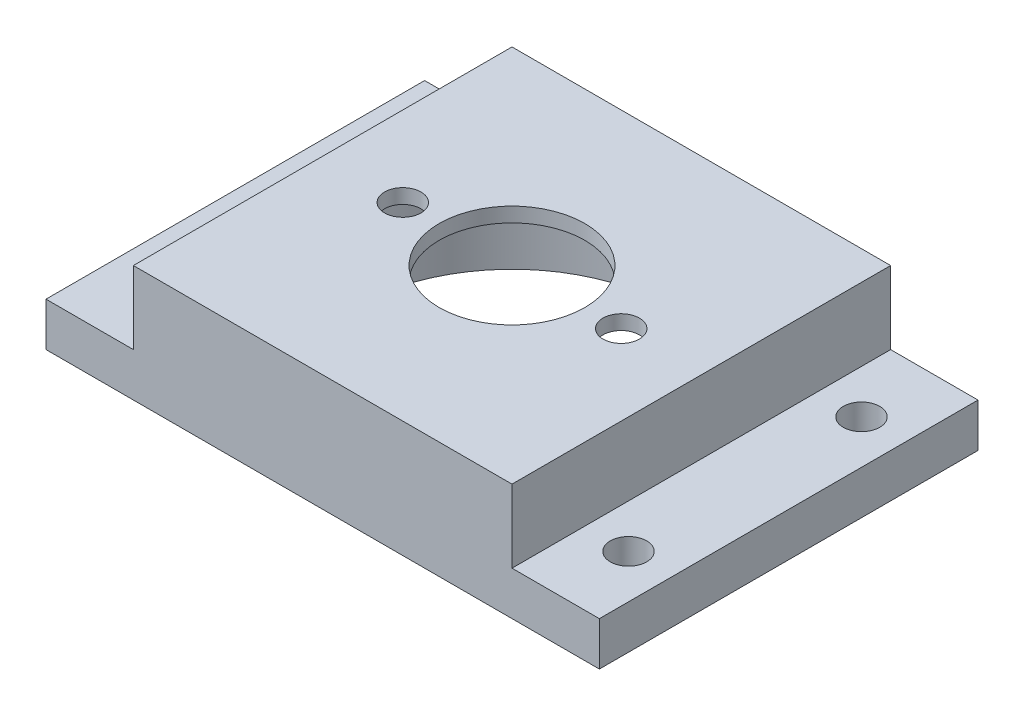
ISO-10303-21;
HEADER;
FILE_DESCRIPTION(('STEP AP214'),'2;1');
FILE_NAME('part.step','',(''),(''),'','','');
FILE_SCHEMA(('AUTOMOTIVE_DESIGN { 1 0 10303 214 1 1 1 1 }'));
ENDSEC;
DATA;
#1=APPLICATION_CONTEXT('core data for automotive mechanical design processes');
#2=APPLICATION_PROTOCOL_DEFINITION('international standard','automotive_design',2000,#1);
#3=PRODUCT_CONTEXT('',#1,'mechanical');
#4=PRODUCT('Part','Part','',(#3));
#5=PRODUCT_RELATED_PRODUCT_CATEGORY('part','',(#4));
#6=PRODUCT_DEFINITION_FORMATION('','',#4);
#7=PRODUCT_DEFINITION_CONTEXT('part definition',#1,'design');
#8=PRODUCT_DEFINITION('design','',#6,#7);
#9=PRODUCT_DEFINITION_SHAPE('','',#8);
#10=(LENGTH_UNIT() NAMED_UNIT(*) SI_UNIT(.MILLI.,.METRE.));
#11=(NAMED_UNIT(*) PLANE_ANGLE_UNIT() SI_UNIT($,.RADIAN.));
#12=(NAMED_UNIT(*) SI_UNIT($,.STERADIAN.) SOLID_ANGLE_UNIT());
#13=UNCERTAINTY_MEASURE_WITH_UNIT(LENGTH_MEASURE(1.E-05),#10,'distance_accuracy_value','');
#14=(GEOMETRIC_REPRESENTATION_CONTEXT(3) GLOBAL_UNCERTAINTY_ASSIGNED_CONTEXT((#13)) GLOBAL_UNIT_ASSIGNED_CONTEXT((#10,
#11,#12)) REPRESENTATION_CONTEXT('',''));
#15=CARTESIAN_POINT('',(0.,0.,0.));
#16=DIRECTION('',(0.,0.,1.));
#17=DIRECTION('',(1.,0.,0.));
#18=AXIS2_PLACEMENT_3D('',#15,#16,#17);
#19=CARTESIAN_POINT('',(19.,0.,13.));
#20=DIRECTION('',(0.,1.,0.));
#21=DIRECTION('',(-1.,0.,0.));
#22=AXIS2_PLACEMENT_3D('',#19,#20,#21);
#23=CYLINDRICAL_SURFACE('',#22,5.);
#24=CARTESIAN_POINT('',(19.,8.,13.));
#25=DIRECTION('',(0.,1.,0.));
#26=DIRECTION('',(-1.,0.,0.));
#27=AXIS2_PLACEMENT_3D('',#24,#25,#26);
#28=CIRCLE('',#27,5.);
#29=CARTESIAN_POINT('',(14.,8.,13.));
#30=VERTEX_POINT('',#29);
#31=EDGE_CURVE('E135',#30,#30,#28,.T.);
#32=ORIENTED_EDGE('',*,*,#31,.T.);
#33=EDGE_LOOP('',(#32));
#34=FACE_BOUND('',#33,.T.);
#35=CARTESIAN_POINT('',(19.,7.,13.));
#36=DIRECTION('',(0.,-1.,0.));
#37=DIRECTION('',(0.,0.,-1.));
#38=AXIS2_PLACEMENT_3D('',#35,#36,#37);
#39=CIRCLE('',#38,5.);
#40=CARTESIAN_POINT('',(19.,7.,8.));
#41=VERTEX_POINT('',#40);
#42=EDGE_CURVE('E178',#41,#41,#39,.F.);
#43=ORIENTED_EDGE('',*,*,#42,.F.);
#44=EDGE_LOOP('',(#43));
#45=FACE_BOUND('',#44,.T.);
#46=ADVANCED_FACE('F32',(#34,#45),#23,.F.);
#47=CARTESIAN_POINT('',(11.5,0.,13.));
#48=DIRECTION('',(0.,1.,0.));
#49=DIRECTION('',(-1.,0.,0.));
#50=AXIS2_PLACEMENT_3D('',#47,#48,#49);
#51=CYLINDRICAL_SURFACE('',#50,1.25);
#52=CARTESIAN_POINT('',(11.5,8.,13.));
#53=DIRECTION('',(0.,1.,0.));
#54=DIRECTION('',(-1.,0.,0.));
#55=AXIS2_PLACEMENT_3D('',#52,#53,#54);
#56=CIRCLE('',#55,1.25);
#57=CARTESIAN_POINT('',(10.25,8.,13.));
#58=VERTEX_POINT('',#57);
#59=EDGE_CURVE('E193',#58,#58,#56,.T.);
#60=ORIENTED_EDGE('',*,*,#59,.T.);
#61=EDGE_LOOP('',(#60));
#62=FACE_BOUND('',#61,.T.);
#63=CARTESIAN_POINT('',(11.5,7.,13.));
#64=DIRECTION('',(0.,-1.,0.));
#65=DIRECTION('',(0.,0.,-1.));
#66=AXIS2_PLACEMENT_3D('',#63,#64,#65);
#67=CIRCLE('',#66,1.25);
#68=CARTESIAN_POINT('',(11.5,7.,11.75));
#69=VERTEX_POINT('',#68);
#70=EDGE_CURVE('E183',#69,#69,#67,.F.);
#71=ORIENTED_EDGE('',*,*,#70,.F.);
#72=EDGE_LOOP('',(#71));
#73=FACE_BOUND('',#72,.T.);
#74=ADVANCED_FACE('F233',(#62,#73),#51,.F.);
#75=CARTESIAN_POINT('',(26.5,0.,13.));
#76=DIRECTION('',(0.,1.,0.));
#77=DIRECTION('',(-1.,0.,0.));
#78=AXIS2_PLACEMENT_3D('',#75,#76,#77);
#79=CYLINDRICAL_SURFACE('',#78,1.25);
#80=CARTESIAN_POINT('',(26.5,8.,13.));
#81=DIRECTION('',(0.,1.,0.));
#82=DIRECTION('',(-1.,0.,0.));
#83=AXIS2_PLACEMENT_3D('',#80,#81,#82);
#84=CIRCLE('',#83,1.25);
#85=CARTESIAN_POINT('',(25.25,8.,13.));
#86=VERTEX_POINT('',#85);
#87=EDGE_CURVE('E161',#86,#86,#84,.T.);
#88=ORIENTED_EDGE('',*,*,#87,.T.);
#89=EDGE_LOOP('',(#88));
#90=FACE_BOUND('',#89,.T.);
#91=CARTESIAN_POINT('',(26.5,7.,13.));
#92=DIRECTION('',(0.,-1.,0.));
#93=DIRECTION('',(0.,0.,-1.));
#94=AXIS2_PLACEMENT_3D('',#91,#92,#93);
#95=CIRCLE('',#94,1.25);
#96=CARTESIAN_POINT('',(26.5,7.,11.75));
#97=VERTEX_POINT('',#96);
#98=EDGE_CURVE('E36',#97,#97,#95,.F.);
#99=ORIENTED_EDGE('',*,*,#98,.F.);
#100=EDGE_LOOP('',(#99));
#101=FACE_BOUND('',#100,.T.);
#102=ADVANCED_FACE('F239',(#90,#101),#79,.F.);
#103=CARTESIAN_POINT('',(0.,3.,26.));
#104=DIRECTION('',(1.,0.,0.));
#105=DIRECTION('',(0.,1.,0.));
#106=AXIS2_PLACEMENT_3D('',#103,#104,#105);
#107=PLANE('',#106);
#108=DIRECTION('',(0.,-1.,0.));
#109=VECTOR('',#108,1.);
#110=CARTESIAN_POINT('',(0.,3.,0.));
#111=LINE('',#110,#109);
#112=CARTESIAN_POINT('',(0.,3.,0.));
#113=VERTEX_POINT('',#112);
#114=CARTESIAN_POINT('',(0.,0.,0.));
#115=VERTEX_POINT('',#114);
#116=EDGE_CURVE('E131',#113,#115,#111,.T.);
#117=ORIENTED_EDGE('',*,*,#116,.T.);
#118=DIRECTION('',(0.,0.,-1.));
#119=VECTOR('',#118,1.);
#120=CARTESIAN_POINT('',(0.,0.,26.));
#121=LINE('',#120,#119);
#122=CARTESIAN_POINT('',(0.,0.,26.));
#123=VERTEX_POINT('',#122);
#124=EDGE_CURVE('E11',#123,#115,#121,.T.);
#125=ORIENTED_EDGE('',*,*,#124,.F.);
#126=DIRECTION('',(0.,-1.,0.));
#127=VECTOR('',#126,1.);
#128=CARTESIAN_POINT('',(0.,3.,26.));
#129=LINE('',#128,#127);
#130=CARTESIAN_POINT('',(0.,3.,26.));
#131=VERTEX_POINT('',#130);
#132=EDGE_CURVE('E146',#131,#123,#129,.T.);
#133=ORIENTED_EDGE('',*,*,#132,.F.);
#134=DIRECTION('',(0.,0.,-1.));
#135=VECTOR('',#134,1.);
#136=CARTESIAN_POINT('',(0.,3.,26.));
#137=LINE('',#136,#135);
#138=EDGE_CURVE('E127',#131,#113,#137,.T.);
#139=ORIENTED_EDGE('',*,*,#138,.T.);
#140=EDGE_LOOP('',(#117,#125,#133,#139));
#141=FACE_BOUND('',#140,.T.);
#142=ADVANCED_FACE('F34',(#141),#107,.F.);
#143=CARTESIAN_POINT('',(30.,0.,26.));
#144=DIRECTION('',(0.,1.,0.));
#145=DIRECTION('',(0.,0.,1.));
#146=AXIS2_PLACEMENT_3D('',#143,#144,#145);
#147=PLANE('',#146);
#148=CARTESIAN_POINT('',(19.,0.,13.));
#149=DIRECTION('',(0.,-1.,0.));
#150=DIRECTION('',(0.,0.,-1.));
#151=AXIS2_PLACEMENT_3D('',#148,#149,#150);
#152=CIRCLE('',#151,11.);
#153=CARTESIAN_POINT('',(19.,0.,2.));
#154=VERTEX_POINT('',#153);
#155=EDGE_CURVE('E265',#154,#154,#152,.T.);
#156=ORIENTED_EDGE('',*,*,#155,.F.);
#157=EDGE_LOOP('',(#156));
#158=FACE_BOUND('',#157,.T.);
#159=CARTESIAN_POINT('',(35.,0.,5.));
#160=DIRECTION('',(0.,1.,0.));
#161=DIRECTION('',(-1.,0.,0.));
#162=AXIS2_PLACEMENT_3D('',#159,#160,#161);
#163=CIRCLE('',#162,1.25);
#164=CARTESIAN_POINT('',(33.75,0.,5.));
#165=VERTEX_POINT('',#164);
#166=EDGE_CURVE('E172',#165,#165,#163,.T.);
#167=ORIENTED_EDGE('',*,*,#166,.T.);
#168=EDGE_LOOP('',(#167));
#169=FACE_BOUND('',#168,.T.);
#170=CARTESIAN_POINT('',(35.,0.,21.));
#171=DIRECTION('',(0.,1.,0.));
#172=DIRECTION('',(-1.,0.,0.));
#173=AXIS2_PLACEMENT_3D('',#170,#171,#172);
#174=CIRCLE('',#173,1.25);
#175=CARTESIAN_POINT('',(33.75,0.,21.));
#176=VERTEX_POINT('',#175);
#177=EDGE_CURVE('E169',#176,#176,#174,.T.);
#178=ORIENTED_EDGE('',*,*,#177,.T.);
#179=EDGE_LOOP('',(#178));
#180=FACE_BOUND('',#179,.T.);
#181=CARTESIAN_POINT('',(3.,0.,5.));
#182=DIRECTION('',(0.,1.,0.));
#183=DIRECTION('',(-1.,0.,0.));
#184=AXIS2_PLACEMENT_3D('',#181,#182,#183);
#185=CIRCLE('',#184,1.25);
#186=CARTESIAN_POINT('',(1.75,0.,5.));
#187=VERTEX_POINT('',#186);
#188=EDGE_CURVE('E166',#187,#187,#185,.T.);
#189=ORIENTED_EDGE('',*,*,#188,.T.);
#190=EDGE_LOOP('',(#189));
#191=FACE_BOUND('',#190,.T.);
#192=CARTESIAN_POINT('',(3.,0.,21.));
#193=DIRECTION('',(0.,1.,0.));
#194=DIRECTION('',(-1.,0.,0.));
#195=AXIS2_PLACEMENT_3D('',#192,#193,#194);
#196=CIRCLE('',#195,1.25);
#197=CARTESIAN_POINT('',(1.75,0.,21.));
#198=VERTEX_POINT('',#197);
#199=EDGE_CURVE('E162',#198,#198,#196,.T.);
#200=ORIENTED_EDGE('',*,*,#199,.T.);
#201=EDGE_LOOP('',(#200));
#202=FACE_BOUND('',#201,.T.);
#203=DIRECTION('',(1.,0.,0.));
#204=VECTOR('',#203,1.);
#205=CARTESIAN_POINT('',(30.,0.,0.));
#206=LINE('',#205,#204);
#207=CARTESIAN_POINT('',(38.,0.,0.));
#208=VERTEX_POINT('',#207);
#209=EDGE_CURVE('E134',#115,#208,#206,.T.);
#210=ORIENTED_EDGE('',*,*,#209,.T.);
#211=DIRECTION('',(0.,0.,-1.));
#212=VECTOR('',#211,1.);
#213=CARTESIAN_POINT('',(38.,0.,26.));
#214=LINE('',#213,#212);
#215=CARTESIAN_POINT('',(38.,0.,26.));
#216=VERTEX_POINT('',#215);
#217=EDGE_CURVE('E42',#216,#208,#214,.T.);
#218=ORIENTED_EDGE('',*,*,#217,.F.);
#219=DIRECTION('',(1.,0.,0.));
#220=VECTOR('',#219,1.);
#221=CARTESIAN_POINT('',(0.,0.,26.));
#222=LINE('',#221,#220);
#223=EDGE_CURVE('E94',#123,#216,#222,.T.);
#224=ORIENTED_EDGE('',*,*,#223,.F.);
#225=ORIENTED_EDGE('',*,*,#124,.T.);
#226=EDGE_LOOP('',(#210,#218,#224,#225));
#227=FACE_BOUND('',#226,.T.);
#228=ADVANCED_FACE('F289',(#158,#169,#180,#191,#202,#227),#147,.F.);
#229=CARTESIAN_POINT('',(38.,0.,26.));
#230=DIRECTION('',(-1.,0.,0.));
#231=DIRECTION('',(0.,0.,1.));
#232=AXIS2_PLACEMENT_3D('',#229,#230,#231);
#233=PLANE('',#232);
#234=DIRECTION('',(0.,1.,0.));
#235=VECTOR('',#234,1.);
#236=CARTESIAN_POINT('',(38.,0.,0.));
#237=LINE('',#236,#235);
#238=CARTESIAN_POINT('',(38.,3.00000000000001,0.));
#239=VERTEX_POINT('',#238);
#240=EDGE_CURVE('E137',#208,#239,#237,.T.);
#241=ORIENTED_EDGE('',*,*,#240,.T.);
#242=DIRECTION('',(0.,0.,-1.));
#243=VECTOR('',#242,1.);
#244=CARTESIAN_POINT('',(38.,3.00000000000001,26.));
#245=LINE('',#244,#243);
#246=CARTESIAN_POINT('',(38.,3.00000000000001,26.));
#247=VERTEX_POINT('',#246);
#248=EDGE_CURVE('E153',#247,#239,#245,.T.);
#249=ORIENTED_EDGE('',*,*,#248,.F.);
#250=DIRECTION('',(0.,1.,0.));
#251=VECTOR('',#250,1.);
#252=CARTESIAN_POINT('',(38.,0.,26.));
#253=LINE('',#252,#251);
#254=EDGE_CURVE('E200',#216,#247,#253,.T.);
#255=ORIENTED_EDGE('',*,*,#254,.F.);
#256=ORIENTED_EDGE('',*,*,#217,.T.);
#257=EDGE_LOOP('',(#241,#249,#255,#256));
#258=FACE_BOUND('',#257,.T.);
#259=ADVANCED_FACE('F391',(#258),#233,.F.);
#260=CARTESIAN_POINT('',(38.,3.00000000000001,26.));
#261=DIRECTION('',(0.,-1.,0.));
#262=DIRECTION('',(1.,0.,0.));
#263=AXIS2_PLACEMENT_3D('',#260,#261,#262);
#264=PLANE('',#263);
#265=CARTESIAN_POINT('',(35.,3.,5.));
#266=DIRECTION('',(0.,-1.,0.));
#267=DIRECTION('',(1.,0.,0.));
#268=AXIS2_PLACEMENT_3D('',#265,#266,#267);
#269=CIRCLE('',#268,1.25);
#270=CARTESIAN_POINT('',(36.25,3.00000000000001,5.));
#271=VERTEX_POINT('',#270);
#272=EDGE_CURVE('E170',#271,#271,#269,.T.);
#273=ORIENTED_EDGE('',*,*,#272,.T.);
#274=EDGE_LOOP('',(#273));
#275=FACE_BOUND('',#274,.T.);
#276=CARTESIAN_POINT('',(35.,3.,21.));
#277=DIRECTION('',(0.,-1.,0.));
#278=DIRECTION('',(1.,0.,0.));
#279=AXIS2_PLACEMENT_3D('',#276,#277,#278);
#280=CIRCLE('',#279,1.25);
#281=CARTESIAN_POINT('',(36.25,3.00000000000001,21.));
#282=VERTEX_POINT('',#281);
#283=EDGE_CURVE('E167',#282,#282,#280,.T.);
#284=ORIENTED_EDGE('',*,*,#283,.T.);
#285=EDGE_LOOP('',(#284));
#286=FACE_BOUND('',#285,.T.);
#287=DIRECTION('',(-1.,0.,0.));
#288=VECTOR('',#287,1.);
#289=CARTESIAN_POINT('',(38.,3.00000000000001,0.));
#290=LINE('',#289,#288);
#291=CARTESIAN_POINT('',(32.,3.,0.));
#292=VERTEX_POINT('',#291);
#293=EDGE_CURVE('E139',#239,#292,#290,.T.);
#294=ORIENTED_EDGE('',*,*,#293,.T.);
#295=DIRECTION('',(0.,0.,-1.));
#296=VECTOR('',#295,1.);
#297=CARTESIAN_POINT('',(32.,3.,26.));
#298=LINE('',#297,#296);
#299=CARTESIAN_POINT('',(32.,3.,26.));
#300=VERTEX_POINT('',#299);
#301=EDGE_CURVE('E150',#300,#292,#298,.T.);
#302=ORIENTED_EDGE('',*,*,#301,.F.);
#303=DIRECTION('',(-1.,0.,0.));
#304=VECTOR('',#303,1.);
#305=CARTESIAN_POINT('',(38.,3.00000000000001,26.));
#306=LINE('',#305,#304);
#307=EDGE_CURVE('E202',#247,#300,#306,.T.);
#308=ORIENTED_EDGE('',*,*,#307,.F.);
#309=ORIENTED_EDGE('',*,*,#248,.T.);
#310=EDGE_LOOP('',(#294,#302,#308,#309));
#311=FACE_BOUND('',#310,.T.);
#312=ADVANCED_FACE('F208',(#275,#286,#311),#264,.F.);
#313=CARTESIAN_POINT('',(32.,3.,26.));
#314=DIRECTION('',(-1.,0.,0.));
#315=DIRECTION('',(0.,0.,1.));
#316=AXIS2_PLACEMENT_3D('',#313,#314,#315);
#317=PLANE('',#316);
#318=DIRECTION('',(0.,1.,0.));
#319=VECTOR('',#318,1.);
#320=CARTESIAN_POINT('',(32.,3.,0.));
#321=LINE('',#320,#319);
#322=CARTESIAN_POINT('',(32.,8.,0.));
#323=VERTEX_POINT('',#322);
#324=EDGE_CURVE('E141',#292,#323,#321,.T.);
#325=ORIENTED_EDGE('',*,*,#324,.T.);
#326=DIRECTION('',(0.,0.,-1.));
#327=VECTOR('',#326,1.);
#328=CARTESIAN_POINT('',(32.,8.,26.));
#329=LINE('',#328,#327);
#330=CARTESIAN_POINT('',(32.,8.,26.));
#331=VERTEX_POINT('',#330);
#332=EDGE_CURVE('E122',#331,#323,#329,.T.);
#333=ORIENTED_EDGE('',*,*,#332,.F.);
#334=DIRECTION('',(0.,1.,0.));
#335=VECTOR('',#334,1.);
#336=CARTESIAN_POINT('',(32.,3.,26.));
#337=LINE('',#336,#335);
#338=EDGE_CURVE('E113',#300,#331,#337,.T.);
#339=ORIENTED_EDGE('',*,*,#338,.F.);
#340=ORIENTED_EDGE('',*,*,#301,.T.);
#341=EDGE_LOOP('',(#325,#333,#339,#340));
#342=FACE_BOUND('',#341,.T.);
#343=ADVANCED_FACE('F212',(#342),#317,.F.);
#344=CARTESIAN_POINT('',(32.,8.,26.));
#345=DIRECTION('',(0.,-1.,0.));
#346=DIRECTION('',(1.,0.,0.));
#347=AXIS2_PLACEMENT_3D('',#344,#345,#346);
#348=PLANE('',#347);
#349=ORIENTED_EDGE('',*,*,#87,.F.);
#350=EDGE_LOOP('',(#349));
#351=FACE_BOUND('',#350,.T.);
#352=ORIENTED_EDGE('',*,*,#59,.F.);
#353=EDGE_LOOP('',(#352));
#354=FACE_BOUND('',#353,.T.);
#355=ORIENTED_EDGE('',*,*,#31,.F.);
#356=EDGE_LOOP('',(#355));
#357=FACE_BOUND('',#356,.T.);
#358=DIRECTION('',(-1.,0.,0.));
#359=VECTOR('',#358,1.);
#360=CARTESIAN_POINT('',(32.,8.,0.));
#361=LINE('',#360,#359);
#362=CARTESIAN_POINT('',(6.,8.,0.));
#363=VERTEX_POINT('',#362);
#364=EDGE_CURVE('E121',#323,#363,#361,.T.);
#365=ORIENTED_EDGE('',*,*,#364,.T.);
#366=DIRECTION('',(0.,0.,-1.));
#367=VECTOR('',#366,1.);
#368=CARTESIAN_POINT('',(6.,8.,26.));
#369=LINE('',#368,#367);
#370=CARTESIAN_POINT('',(6.,8.,26.));
#371=VERTEX_POINT('',#370);
#372=EDGE_CURVE('E118',#371,#363,#369,.T.);
#373=ORIENTED_EDGE('',*,*,#372,.F.);
#374=DIRECTION('',(-1.,0.,0.));
#375=VECTOR('',#374,1.);
#376=CARTESIAN_POINT('',(32.,8.,26.));
#377=LINE('',#376,#375);
#378=EDGE_CURVE('E107',#331,#371,#377,.T.);
#379=ORIENTED_EDGE('',*,*,#378,.F.);
#380=ORIENTED_EDGE('',*,*,#332,.T.);
#381=EDGE_LOOP('',(#365,#373,#379,#380));
#382=FACE_BOUND('',#381,.T.);
#383=ADVANCED_FACE('F119',(#351,#354,#357,#382),#348,.F.);
#384=CARTESIAN_POINT('',(6.,8.,26.));
#385=DIRECTION('',(1.,0.,0.));
#386=DIRECTION('',(0.,1.,0.));
#387=AXIS2_PLACEMENT_3D('',#384,#385,#386);
#388=PLANE('',#387);
#389=DIRECTION('',(0.,-1.,0.));
#390=VECTOR('',#389,1.);
#391=CARTESIAN_POINT('',(6.,8.,0.));
#392=LINE('',#391,#390);
#393=CARTESIAN_POINT('',(6.,3.,0.));
#394=VERTEX_POINT('',#393);
#395=EDGE_CURVE('E80',#363,#394,#392,.T.);
#396=ORIENTED_EDGE('',*,*,#395,.T.);
#397=DIRECTION('',(0.,0.,-1.));
#398=VECTOR('',#397,1.);
#399=CARTESIAN_POINT('',(6.,3.,26.));
#400=LINE('',#399,#398);
#401=CARTESIAN_POINT('',(6.,3.,26.));
#402=VERTEX_POINT('',#401);
#403=EDGE_CURVE('E123',#402,#394,#400,.T.);
#404=ORIENTED_EDGE('',*,*,#403,.F.);
#405=DIRECTION('',(0.,-1.,0.));
#406=VECTOR('',#405,1.);
#407=CARTESIAN_POINT('',(6.,8.,26.));
#408=LINE('',#407,#406);
#409=EDGE_CURVE('E111',#371,#402,#408,.T.);
#410=ORIENTED_EDGE('',*,*,#409,.F.);
#411=ORIENTED_EDGE('',*,*,#372,.T.);
#412=EDGE_LOOP('',(#396,#404,#410,#411));
#413=FACE_BOUND('',#412,.T.);
#414=ADVANCED_FACE('F125',(#413),#388,.F.);
#415=CARTESIAN_POINT('',(6.,3.,26.));
#416=DIRECTION('',(0.,-1.,0.));
#417=DIRECTION('',(1.,0.,0.));
#418=AXIS2_PLACEMENT_3D('',#415,#416,#417);
#419=PLANE('',#418);
#420=CARTESIAN_POINT('',(3.,3.,5.));
#421=DIRECTION('',(0.,-1.,0.));
#422=DIRECTION('',(1.,0.,0.));
#423=AXIS2_PLACEMENT_3D('',#420,#421,#422);
#424=CIRCLE('',#423,1.25);
#425=CARTESIAN_POINT('',(4.25,3.,5.));
#426=VERTEX_POINT('',#425);
#427=EDGE_CURVE('E163',#426,#426,#424,.T.);
#428=ORIENTED_EDGE('',*,*,#427,.T.);
#429=EDGE_LOOP('',(#428));
#430=FACE_BOUND('',#429,.T.);
#431=CARTESIAN_POINT('',(3.,3.,21.));
#432=DIRECTION('',(0.,-1.,0.));
#433=DIRECTION('',(1.,0.,0.));
#434=AXIS2_PLACEMENT_3D('',#431,#432,#433);
#435=CIRCLE('',#434,1.25);
#436=CARTESIAN_POINT('',(4.25,3.,21.));
#437=VERTEX_POINT('',#436);
#438=EDGE_CURVE('E158',#437,#437,#435,.T.);
#439=ORIENTED_EDGE('',*,*,#438,.T.);
#440=EDGE_LOOP('',(#439));
#441=FACE_BOUND('',#440,.T.);
#442=DIRECTION('',(-1.,0.,0.));
#443=VECTOR('',#442,1.);
#444=CARTESIAN_POINT('',(6.,3.,0.));
#445=LINE('',#444,#443);
#446=EDGE_CURVE('E86',#394,#113,#445,.T.);
#447=ORIENTED_EDGE('',*,*,#446,.T.);
#448=ORIENTED_EDGE('',*,*,#138,.F.);
#449=DIRECTION('',(-1.,0.,0.));
#450=VECTOR('',#449,1.);
#451=CARTESIAN_POINT('',(6.,3.,26.));
#452=LINE('',#451,#450);
#453=EDGE_CURVE('E51',#402,#131,#452,.T.);
#454=ORIENTED_EDGE('',*,*,#453,.F.);
#455=ORIENTED_EDGE('',*,*,#403,.T.);
#456=EDGE_LOOP('',(#447,#448,#454,#455));
#457=FACE_BOUND('',#456,.T.);
#458=ADVANCED_FACE('F220',(#430,#441,#457),#419,.F.);
#459=CARTESIAN_POINT('',(0.,0.,26.));
#460=DIRECTION('',(0.,0.,1.));
#461=DIRECTION('',(1.,0.,0.));
#462=AXIS2_PLACEMENT_3D('',#459,#460,#461);
#463=PLANE('',#462);
#464=ORIENTED_EDGE('',*,*,#132,.T.);
#465=ORIENTED_EDGE('',*,*,#223,.T.);
#466=ORIENTED_EDGE('',*,*,#254,.T.);
#467=ORIENTED_EDGE('',*,*,#307,.T.);
#468=ORIENTED_EDGE('',*,*,#338,.T.);
#469=ORIENTED_EDGE('',*,*,#378,.T.);
#470=ORIENTED_EDGE('',*,*,#409,.T.);
#471=ORIENTED_EDGE('',*,*,#453,.T.);
#472=EDGE_LOOP('',(#464,#465,#466,#467,#468,#469,#470,#471));
#473=FACE_BOUND('',#472,.T.);
#474=ADVANCED_FACE('F109',(#473),#463,.T.);
#475=CARTESIAN_POINT('',(0.,0.,0.));
#476=DIRECTION('',(0.,0.,1.));
#477=DIRECTION('',(1.,0.,0.));
#478=AXIS2_PLACEMENT_3D('',#475,#476,#477);
#479=PLANE('',#478);
#480=CARTESIAN_POINT('',(9.,2.5,0.));
#481=DIRECTION('',(0.,0.,-1.));
#482=DIRECTION('',(-1.,0.,0.));
#483=AXIS2_PLACEMENT_3D('',#480,#481,#482);
#484=CIRCLE('',#483,1.);
#485=CARTESIAN_POINT('',(8.,2.5,0.));
#486=VERTEX_POINT('',#485);
#487=EDGE_CURVE('E256',#486,#486,#484,.T.);
#488=ORIENTED_EDGE('',*,*,#487,.F.);
#489=EDGE_LOOP('',(#488));
#490=FACE_BOUND('',#489,.T.);
#491=CARTESIAN_POINT('',(29.,2.5,0.));
#492=DIRECTION('',(0.,0.,-1.));
#493=DIRECTION('',(-1.,0.,0.));
#494=AXIS2_PLACEMENT_3D('',#491,#492,#493);
#495=CIRCLE('',#494,1.);
#496=CARTESIAN_POINT('',(28.,2.5,0.));
#497=VERTEX_POINT('',#496);
#498=EDGE_CURVE('E259',#497,#497,#495,.T.);
#499=ORIENTED_EDGE('',*,*,#498,.F.);
#500=EDGE_LOOP('',(#499));
#501=FACE_BOUND('',#500,.T.);
#502=ORIENTED_EDGE('',*,*,#116,.F.);
#503=ORIENTED_EDGE('',*,*,#446,.F.);
#504=ORIENTED_EDGE('',*,*,#395,.F.);
#505=ORIENTED_EDGE('',*,*,#364,.F.);
#506=ORIENTED_EDGE('',*,*,#324,.F.);
#507=ORIENTED_EDGE('',*,*,#293,.F.);
#508=ORIENTED_EDGE('',*,*,#240,.F.);
#509=ORIENTED_EDGE('',*,*,#209,.F.);
#510=EDGE_LOOP('',(#502,#503,#504,#505,#506,#507,#508,#509));
#511=FACE_BOUND('',#510,.T.);
#512=ADVANCED_FACE('F215',(#490,#501,#511),#479,.F.);
#513=CARTESIAN_POINT('',(3.,0.,21.));
#514=DIRECTION('',(0.,1.,0.));
#515=DIRECTION('',(-1.,0.,0.));
#516=AXIS2_PLACEMENT_3D('',#513,#514,#515);
#517=CYLINDRICAL_SURFACE('',#516,1.25);
#518=ORIENTED_EDGE('',*,*,#199,.F.);
#519=EDGE_LOOP('',(#518));
#520=FACE_BOUND('',#519,.T.);
#521=ORIENTED_EDGE('',*,*,#438,.F.);
#522=EDGE_LOOP('',(#521));
#523=FACE_BOUND('',#522,.T.);
#524=ADVANCED_FACE('F245',(#520,#523),#517,.F.);
#525=CARTESIAN_POINT('',(3.,0.,5.));
#526=DIRECTION('',(0.,1.,0.));
#527=DIRECTION('',(-1.,0.,0.));
#528=AXIS2_PLACEMENT_3D('',#525,#526,#527);
#529=CYLINDRICAL_SURFACE('',#528,1.25);
#530=ORIENTED_EDGE('',*,*,#188,.F.);
#531=EDGE_LOOP('',(#530));
#532=FACE_BOUND('',#531,.T.);
#533=ORIENTED_EDGE('',*,*,#427,.F.);
#534=EDGE_LOOP('',(#533));
#535=FACE_BOUND('',#534,.T.);
#536=ADVANCED_FACE('F250',(#532,#535),#529,.F.);
#537=CARTESIAN_POINT('',(35.,0.,21.));
#538=DIRECTION('',(0.,1.,0.));
#539=DIRECTION('',(-1.,0.,0.));
#540=AXIS2_PLACEMENT_3D('',#537,#538,#539);
#541=CYLINDRICAL_SURFACE('',#540,1.25);
#542=ORIENTED_EDGE('',*,*,#177,.F.);
#543=EDGE_LOOP('',(#542));
#544=FACE_BOUND('',#543,.T.);
#545=ORIENTED_EDGE('',*,*,#283,.F.);
#546=EDGE_LOOP('',(#545));
#547=FACE_BOUND('',#546,.T.);
#548=ADVANCED_FACE('F293',(#544,#547),#541,.F.);
#549=CARTESIAN_POINT('',(35.,0.,5.));
#550=DIRECTION('',(0.,1.,0.));
#551=DIRECTION('',(-1.,0.,0.));
#552=AXIS2_PLACEMENT_3D('',#549,#550,#551);
#553=CYLINDRICAL_SURFACE('',#552,1.25);
#554=ORIENTED_EDGE('',*,*,#166,.F.);
#555=EDGE_LOOP('',(#554));
#556=FACE_BOUND('',#555,.T.);
#557=ORIENTED_EDGE('',*,*,#272,.F.);
#558=EDGE_LOOP('',(#557));
#559=FACE_BOUND('',#558,.T.);
#560=ADVANCED_FACE('F297',(#556,#559),#553,.F.);
#561=CARTESIAN_POINT('',(19.,7.,13.));
#562=DIRECTION('',(0.,-1.,0.));
#563=DIRECTION('',(0.,0.,-1.));
#564=AXIS2_PLACEMENT_3D('',#561,#562,#563);
#565=PLANE('',#564);
#566=ORIENTED_EDGE('',*,*,#70,.T.);
#567=EDGE_LOOP('',(#566));
#568=FACE_BOUND('',#567,.T.);
#569=CARTESIAN_POINT('',(19.,7.,13.));
#570=DIRECTION('',(0.,-1.,0.));
#571=DIRECTION('',(0.,0.,-1.));
#572=AXIS2_PLACEMENT_3D('',#569,#570,#571);
#573=CIRCLE('',#572,11.);
#574=CARTESIAN_POINT('',(19.,7.,2.));
#575=VERTEX_POINT('',#574);
#576=EDGE_CURVE('E271',#575,#575,#573,.T.);
#577=ORIENTED_EDGE('',*,*,#576,.T.);
#578=EDGE_LOOP('',(#577));
#579=FACE_BOUND('',#578,.T.);
#580=ORIENTED_EDGE('',*,*,#98,.T.);
#581=EDGE_LOOP('',(#580));
#582=FACE_BOUND('',#581,.T.);
#583=ORIENTED_EDGE('',*,*,#42,.T.);
#584=EDGE_LOOP('',(#583));
#585=FACE_BOUND('',#584,.T.);
#586=ADVANCED_FACE('F281',(#568,#579,#582,#585),#565,.T.);
#587=CARTESIAN_POINT('',(19.,7.,13.));
#588=DIRECTION('',(0.,-1.,0.));
#589=DIRECTION('',(0.,0.,-1.));
#590=AXIS2_PLACEMENT_3D('',#587,#588,#589);
#591=CYLINDRICAL_SURFACE('',#590,11.);
#592=ORIENTED_EDGE('',*,*,#576,.F.);
#593=EDGE_LOOP('',(#592));
#594=FACE_BOUND('',#593,.T.);
#595=ORIENTED_EDGE('',*,*,#155,.T.);
#596=EDGE_LOOP('',(#595));
#597=FACE_BOUND('',#596,.T.);
#598=ADVANCED_FACE('F302',(#594,#597),#591,.F.);
#599=CARTESIAN_POINT('',(29.,2.5,6.));
#600=DIRECTION('',(0.,0.,-1.));
#601=DIRECTION('',(-1.,0.,0.));
#602=AXIS2_PLACEMENT_3D('',#599,#600,#601);
#603=CYLINDRICAL_SURFACE('',#602,1.);
#604=CARTESIAN_POINT('',(29.,2.5,6.));
#605=DIRECTION('',(0.,0.,-1.));
#606=DIRECTION('',(-1.,0.,0.));
#607=AXIS2_PLACEMENT_3D('',#604,#605,#606);
#608=CIRCLE('',#607,1.);
#609=CARTESIAN_POINT('',(28.,2.5,6.));
#610=VERTEX_POINT('',#609);
#611=EDGE_CURVE('E261',#610,#610,#608,.T.);
#612=ORIENTED_EDGE('',*,*,#611,.F.);
#613=EDGE_LOOP('',(#612));
#614=FACE_BOUND('',#613,.T.);
#615=ORIENTED_EDGE('',*,*,#498,.T.);
#616=EDGE_LOOP('',(#615));
#617=FACE_BOUND('',#616,.T.);
#618=ADVANCED_FACE('F305',(#614,#617),#603,.F.);
#619=CARTESIAN_POINT('',(29.,2.5,6.));
#620=DIRECTION('',(0.,0.,-1.));
#621=DIRECTION('',(-1.,0.,0.));
#622=AXIS2_PLACEMENT_3D('',#619,#620,#621);
#623=PLANE('',#622);
#624=ORIENTED_EDGE('',*,*,#611,.T.);
#625=EDGE_LOOP('',(#624));
#626=FACE_BOUND('',#625,.T.);
#627=ADVANCED_FACE('F311',(#626),#623,.T.);
#628=CARTESIAN_POINT('',(9.,2.5,6.));
#629=DIRECTION('',(0.,0.,-1.));
#630=DIRECTION('',(-1.,0.,0.));
#631=AXIS2_PLACEMENT_3D('',#628,#629,#630);
#632=CYLINDRICAL_SURFACE('',#631,1.);
#633=CARTESIAN_POINT('',(9.,2.5,6.));
#634=DIRECTION('',(0.,0.,-1.));
#635=DIRECTION('',(-1.,0.,0.));
#636=AXIS2_PLACEMENT_3D('',#633,#634,#635);
#637=CIRCLE('',#636,1.);
#638=CARTESIAN_POINT('',(8.,2.5,6.));
#639=VERTEX_POINT('',#638);
#640=EDGE_CURVE('E262',#639,#639,#637,.T.);
#641=ORIENTED_EDGE('',*,*,#640,.F.);
#642=EDGE_LOOP('',(#641));
#643=FACE_BOUND('',#642,.T.);
#644=ORIENTED_EDGE('',*,*,#487,.T.);
#645=EDGE_LOOP('',(#644));
#646=FACE_BOUND('',#645,.T.);
#647=ADVANCED_FACE('F315',(#643,#646),#632,.F.);
#648=CARTESIAN_POINT('',(9.,2.5,6.));
#649=DIRECTION('',(0.,0.,-1.));
#650=DIRECTION('',(-1.,0.,0.));
#651=AXIS2_PLACEMENT_3D('',#648,#649,#650);
#652=PLANE('',#651);
#653=ORIENTED_EDGE('',*,*,#640,.T.);
#654=EDGE_LOOP('',(#653));
#655=FACE_BOUND('',#654,.T.);
#656=ADVANCED_FACE('F319',(#655),#652,.T.);
#657=CLOSED_SHELL('',(#46,#74,#102,#142,#228,#259,#312,#343,#383,#414,#458,#474,#512,#524,#536,
#548,#560,#586,#598,#618,#627,#647,#656));
#658=MANIFOLD_SOLID_BREP('B2',#657);
#659=ADVANCED_BREP_SHAPE_REPRESENTATION('',(#18,#658),#14);
#660=SHAPE_DEFINITION_REPRESENTATION(#9,#659);
ENDSEC;
END-ISO-10303-21;
